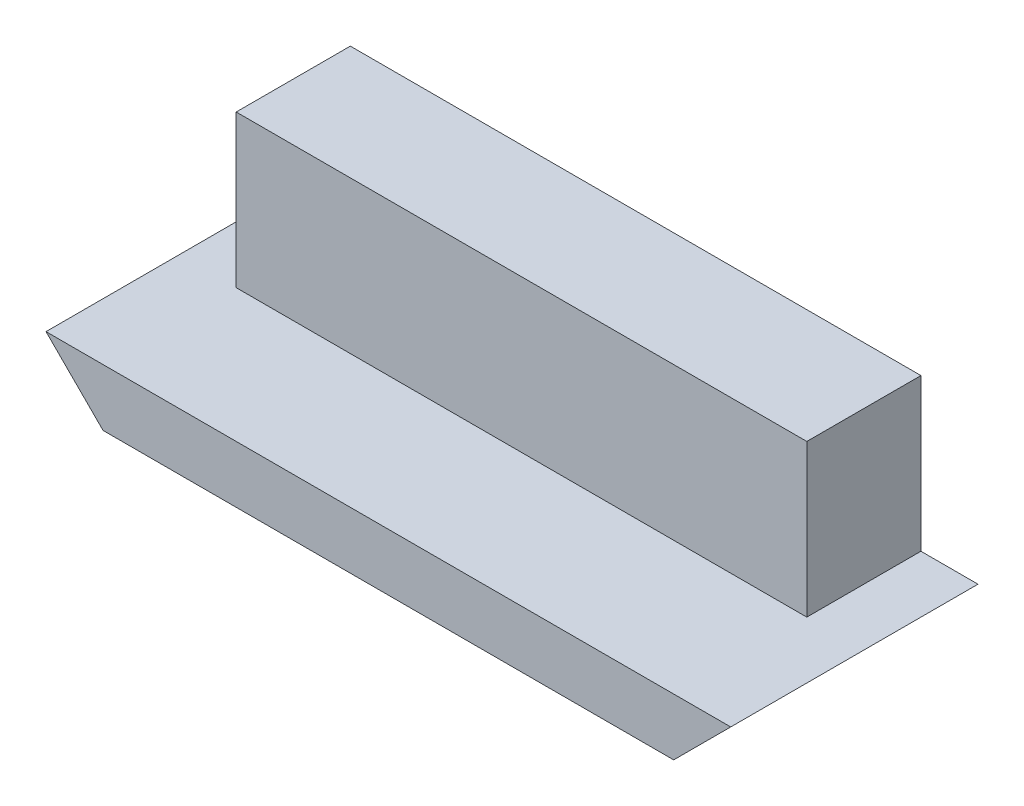
ISO-10303-21;
HEADER;
FILE_DESCRIPTION(('STEP AP214'),'2;1');
FILE_NAME('part.step','',(''),(''),'','','');
FILE_SCHEMA(('AUTOMOTIVE_DESIGN { 1 0 10303 214 1 1 1 1 }'));
ENDSEC;
DATA;
#1=APPLICATION_CONTEXT('core data for automotive mechanical design processes');
#2=APPLICATION_PROTOCOL_DEFINITION('international standard','automotive_design',2000,#1);
#3=PRODUCT_CONTEXT('',#1,'mechanical');
#4=PRODUCT('Part','Part','',(#3));
#5=PRODUCT_RELATED_PRODUCT_CATEGORY('part','',(#4));
#6=PRODUCT_DEFINITION_FORMATION('','',#4);
#7=PRODUCT_DEFINITION_CONTEXT('part definition',#1,'design');
#8=PRODUCT_DEFINITION('design','',#6,#7);
#9=PRODUCT_DEFINITION_SHAPE('','',#8);
#10=(LENGTH_UNIT() NAMED_UNIT(*) SI_UNIT(.MILLI.,.METRE.));
#11=(NAMED_UNIT(*) PLANE_ANGLE_UNIT() SI_UNIT($,.RADIAN.));
#12=(NAMED_UNIT(*) SI_UNIT($,.STERADIAN.) SOLID_ANGLE_UNIT());
#13=UNCERTAINTY_MEASURE_WITH_UNIT(LENGTH_MEASURE(1.E-05),#10,'distance_accuracy_value','');
#14=(GEOMETRIC_REPRESENTATION_CONTEXT(3) GLOBAL_UNCERTAINTY_ASSIGNED_CONTEXT((#13)) GLOBAL_UNIT_ASSIGNED_CONTEXT((#10,
#11,#12)) REPRESENTATION_CONTEXT('',''));
#15=CARTESIAN_POINT('',(0.,0.,0.));
#16=DIRECTION('',(0.,0.,1.));
#17=DIRECTION('',(1.,0.,0.));
#18=AXIS2_PLACEMENT_3D('',#15,#16,#17);
#19=CARTESIAN_POINT('',(15.,1.5,6.5));
#20=DIRECTION('',(-1.,0.,0.));
#21=DIRECTION('',(0.,0.,1.));
#22=AXIS2_PLACEMENT_3D('',#19,#20,#21);
#23=PLANE('',#22);
#24=DIRECTION('',(0.,-1.,0.));
#25=VECTOR('',#24,1.);
#26=CARTESIAN_POINT('',(15.,1.5,3.));
#27=LINE('',#26,#25);
#28=CARTESIAN_POINT('',(15.,5.5,3.));
#29=VERTEX_POINT('',#28);
#30=CARTESIAN_POINT('',(15.,1.5,3.));
#31=VERTEX_POINT('',#30);
#32=EDGE_CURVE('E118',#29,#31,#27,.T.);
#33=ORIENTED_EDGE('',*,*,#32,.T.);
#34=DIRECTION('',(0.,0.,-1.));
#35=VECTOR('',#34,1.);
#36=CARTESIAN_POINT('',(15.,1.5,6.5));
#37=LINE('',#36,#35);
#38=CARTESIAN_POINT('',(15.,1.5,0.));
#39=VERTEX_POINT('',#38);
#40=EDGE_CURVE('E130',#31,#39,#37,.T.);
#41=ORIENTED_EDGE('',*,*,#40,.T.);
#42=DIRECTION('',(0.,1.,0.));
#43=VECTOR('',#42,1.);
#44=CARTESIAN_POINT('',(15.,1.5,0.));
#45=LINE('',#44,#43);
#46=CARTESIAN_POINT('',(15.,5.5,0.));
#47=VERTEX_POINT('',#46);
#48=EDGE_CURVE('E172',#39,#47,#45,.T.);
#49=ORIENTED_EDGE('',*,*,#48,.T.);
#50=DIRECTION('',(0.,0.,-1.));
#51=VECTOR('',#50,1.);
#52=CARTESIAN_POINT('',(15.,5.5,6.5));
#53=LINE('',#52,#51);
#54=EDGE_CURVE('E132',#29,#47,#53,.T.);
#55=ORIENTED_EDGE('',*,*,#54,.F.);
#56=EDGE_LOOP('',(#33,#41,#49,#55));
#57=FACE_BOUND('',#56,.T.);
#58=ADVANCED_FACE('F41',(#57),#23,.F.);
#59=CARTESIAN_POINT('',(0.,5.5,6.5));
#60=DIRECTION('',(0.,-1.,0.));
#61=DIRECTION('',(0.,0.,-1.));
#62=AXIS2_PLACEMENT_3D('',#59,#60,#61);
#63=PLANE('',#62);
#64=DIRECTION('',(1.,0.,0.));
#65=VECTOR('',#64,1.);
#66=CARTESIAN_POINT('',(0.,5.5,3.));
#67=LINE('',#66,#65);
#68=CARTESIAN_POINT('',(0.,5.5,3.));
#69=VERTEX_POINT('',#68);
#70=EDGE_CURVE('E134',#69,#29,#67,.T.);
#71=ORIENTED_EDGE('',*,*,#70,.T.);
#72=ORIENTED_EDGE('',*,*,#54,.T.);
#73=DIRECTION('',(-1.,0.,0.));
#74=VECTOR('',#73,1.);
#75=CARTESIAN_POINT('',(0.,5.5,0.));
#76=LINE('',#75,#74);
#77=CARTESIAN_POINT('',(0.,5.5,0.));
#78=VERTEX_POINT('',#77);
#79=EDGE_CURVE('E168',#47,#78,#76,.T.);
#80=ORIENTED_EDGE('',*,*,#79,.T.);
#81=DIRECTION('',(0.,0.,-1.));
#82=VECTOR('',#81,1.);
#83=CARTESIAN_POINT('',(0.,5.5,6.5));
#84=LINE('',#83,#82);
#85=EDGE_CURVE('E145',#69,#78,#84,.T.);
#86=ORIENTED_EDGE('',*,*,#85,.F.);
#87=EDGE_LOOP('',(#71,#72,#80,#86));
#88=FACE_BOUND('',#87,.T.);
#89=ADVANCED_FACE('F197',(#88),#63,.F.);
#90=CARTESIAN_POINT('',(0.,1.5,6.5));
#91=DIRECTION('',(1.,0.,0.));
#92=DIRECTION('',(0.,0.,-1.));
#93=AXIS2_PLACEMENT_3D('',#90,#91,#92);
#94=PLANE('',#93);
#95=DIRECTION('',(0.,1.,0.));
#96=VECTOR('',#95,1.);
#97=CARTESIAN_POINT('',(0.,1.5,3.));
#98=LINE('',#97,#96);
#99=CARTESIAN_POINT('',(0.,1.5,3.));
#100=VERTEX_POINT('',#99);
#101=EDGE_CURVE('E121',#100,#69,#98,.T.);
#102=ORIENTED_EDGE('',*,*,#101,.T.);
#103=ORIENTED_EDGE('',*,*,#85,.T.);
#104=DIRECTION('',(0.,-1.,0.));
#105=VECTOR('',#104,1.);
#106=CARTESIAN_POINT('',(0.,1.5,0.));
#107=LINE('',#106,#105);
#108=CARTESIAN_POINT('',(0.,1.5,0.));
#109=VERTEX_POINT('',#108);
#110=EDGE_CURVE('E164',#78,#109,#107,.T.);
#111=ORIENTED_EDGE('',*,*,#110,.T.);
#112=DIRECTION('',(0.,0.,-1.));
#113=VECTOR('',#112,1.);
#114=CARTESIAN_POINT('',(0.,1.5,6.5));
#115=LINE('',#114,#113);
#116=EDGE_CURVE('E150',#100,#109,#115,.T.);
#117=ORIENTED_EDGE('',*,*,#116,.F.);
#118=EDGE_LOOP('',(#102,#103,#111,#117));
#119=FACE_BOUND('',#118,.T.);
#120=ADVANCED_FACE('F199',(#119),#94,.F.);
#121=CARTESIAN_POINT('',(0.,0.,6.5));
#122=DIRECTION('',(0.,1.,0.));
#123=DIRECTION('',(0.,0.,1.));
#124=AXIS2_PLACEMENT_3D('',#121,#122,#123);
#125=PLANE('',#124);
#126=DIRECTION('',(1.,0.,0.));
#127=VECTOR('',#126,1.);
#128=CARTESIAN_POINT('',(0.,0.,0.));
#129=LINE('',#128,#127);
#130=CARTESIAN_POINT('',(0.,0.,0.));
#131=VERTEX_POINT('',#130);
#132=CARTESIAN_POINT('',(15.,0.,0.));
#133=VERTEX_POINT('',#132);
#134=EDGE_CURVE('E125',#131,#133,#129,.T.);
#135=ORIENTED_EDGE('',*,*,#134,.T.);
#136=DIRECTION('',(0.,0.,-1.));
#137=VECTOR('',#136,1.);
#138=CARTESIAN_POINT('',(15.,0.,6.5));
#139=LINE('',#138,#137);
#140=CARTESIAN_POINT('',(15.,0.,6.5));
#141=VERTEX_POINT('',#140);
#142=EDGE_CURVE('E12',#141,#133,#139,.T.);
#143=ORIENTED_EDGE('',*,*,#142,.F.);
#144=DIRECTION('',(1.,0.,0.));
#145=VECTOR('',#144,1.);
#146=CARTESIAN_POINT('',(0.,0.,6.5));
#147=LINE('',#146,#145);
#148=CARTESIAN_POINT('',(0.,0.,6.5));
#149=VERTEX_POINT('',#148);
#150=EDGE_CURVE('E161',#149,#141,#147,.T.);
#151=ORIENTED_EDGE('',*,*,#150,.F.);
#152=DIRECTION('',(0.,0.,-1.));
#153=VECTOR('',#152,1.);
#154=CARTESIAN_POINT('',(0.,0.,6.5));
#155=LINE('',#154,#153);
#156=EDGE_CURVE('E156',#149,#131,#155,.T.);
#157=ORIENTED_EDGE('',*,*,#156,.T.);
#158=EDGE_LOOP('',(#135,#143,#151,#157));
#159=FACE_BOUND('',#158,.T.);
#160=ADVANCED_FACE('F43',(#159),#125,.F.);
#161=CARTESIAN_POINT('',(15.,0.,6.5));
#162=DIRECTION('',(-0.707106781186548,0.707106781186546,0.));
#163=DIRECTION('',(-0.707106781186547,-0.707106781186549,0.));
#164=AXIS2_PLACEMENT_3D('',#161,#162,#163);
#165=PLANE('',#164);
#166=DIRECTION('',(0.707106781186547,0.707106781186549,0.));
#167=VECTOR('',#166,1.);
#168=CARTESIAN_POINT('',(15.,0.,0.));
#169=LINE('',#168,#167);
#170=CARTESIAN_POINT('',(16.5,1.5,0.));
#171=VERTEX_POINT('',#170);
#172=EDGE_CURVE('E177',#133,#171,#169,.T.);
#173=ORIENTED_EDGE('',*,*,#172,.T.);
#174=DIRECTION('',(0.,0.,-1.));
#175=VECTOR('',#174,1.);
#176=CARTESIAN_POINT('',(16.5,1.5,6.5));
#177=LINE('',#176,#175);
#178=CARTESIAN_POINT('',(16.5,1.5,6.5));
#179=VERTEX_POINT('',#178);
#180=EDGE_CURVE('E51',#179,#171,#177,.T.);
#181=ORIENTED_EDGE('',*,*,#180,.F.);
#182=DIRECTION('',(0.707106781186547,0.707106781186549,0.));
#183=VECTOR('',#182,1.);
#184=CARTESIAN_POINT('',(15.,0.,6.5));
#185=LINE('',#184,#183);
#186=EDGE_CURVE('E101',#141,#179,#185,.T.);
#187=ORIENTED_EDGE('',*,*,#186,.F.);
#188=ORIENTED_EDGE('',*,*,#142,.T.);
#189=EDGE_LOOP('',(#173,#181,#187,#188));
#190=FACE_BOUND('',#189,.T.);
#191=ADVANCED_FACE('F211',(#190),#165,.F.);
#192=CARTESIAN_POINT('',(-1.5,1.5,6.5));
#193=DIRECTION('',(0.,-1.,0.));
#194=DIRECTION('',(0.,0.,-1.));
#195=AXIS2_PLACEMENT_3D('',#192,#193,#194);
#196=PLANE('',#195);
#197=DIRECTION('',(-1.,0.,0.));
#198=VECTOR('',#197,1.);
#199=CARTESIAN_POINT('',(-1.5,1.5,0.));
#200=LINE('',#199,#198);
#201=CARTESIAN_POINT('',(-1.5,1.5,0.));
#202=VERTEX_POINT('',#201);
#203=EDGE_CURVE('E88',#109,#202,#200,.T.);
#204=ORIENTED_EDGE('',*,*,#203,.T.);
#205=DIRECTION('',(0.,0.,-1.));
#206=VECTOR('',#205,1.);
#207=CARTESIAN_POINT('',(-1.5,1.5,6.5));
#208=LINE('',#207,#206);
#209=CARTESIAN_POINT('',(-1.5,1.5,6.5));
#210=VERTEX_POINT('',#209);
#211=EDGE_CURVE('E153',#210,#202,#208,.T.);
#212=ORIENTED_EDGE('',*,*,#211,.F.);
#213=DIRECTION('',(-1.,0.,0.));
#214=VECTOR('',#213,1.);
#215=CARTESIAN_POINT('',(16.5,1.5,6.5));
#216=LINE('',#215,#214);
#217=EDGE_CURVE('E185',#179,#210,#216,.T.);
#218=ORIENTED_EDGE('',*,*,#217,.F.);
#219=ORIENTED_EDGE('',*,*,#180,.T.);
#220=DIRECTION('',(-1.,0.,0.));
#221=VECTOR('',#220,1.);
#222=CARTESIAN_POINT('',(16.5,1.5,0.));
#223=LINE('',#222,#221);
#224=EDGE_CURVE('E139',#171,#39,#223,.T.);
#225=ORIENTED_EDGE('',*,*,#224,.T.);
#226=ORIENTED_EDGE('',*,*,#40,.F.);
#227=DIRECTION('',(-1.,0.,0.));
#228=VECTOR('',#227,1.);
#229=CARTESIAN_POINT('',(0.,1.5,3.));
#230=LINE('',#229,#228);
#231=EDGE_CURVE('E115',#31,#100,#230,.T.);
#232=ORIENTED_EDGE('',*,*,#231,.T.);
#233=ORIENTED_EDGE('',*,*,#116,.T.);
#234=EDGE_LOOP('',(#204,#212,#218,#219,#225,#226,#232,#233));
#235=FACE_BOUND('',#234,.T.);
#236=ADVANCED_FACE('F136',(#235),#196,.F.);
#237=CARTESIAN_POINT('',(0.,0.,6.5));
#238=DIRECTION('',(0.707106781186548,0.707106781186548,0.));
#239=DIRECTION('',(-0.707106781186548,0.707106781186548,0.));
#240=AXIS2_PLACEMENT_3D('',#237,#238,#239);
#241=PLANE('',#240);
#242=DIRECTION('',(0.707106781186548,-0.707106781186548,0.));
#243=VECTOR('',#242,1.);
#244=CARTESIAN_POINT('',(0.,0.,0.));
#245=LINE('',#244,#243);
#246=EDGE_CURVE('E94',#202,#131,#245,.T.);
#247=ORIENTED_EDGE('',*,*,#246,.T.);
#248=ORIENTED_EDGE('',*,*,#156,.F.);
#249=DIRECTION('',(0.707106781186548,-0.707106781186548,0.));
#250=VECTOR('',#249,1.);
#251=CARTESIAN_POINT('',(0.,0.,6.5));
#252=LINE('',#251,#250);
#253=EDGE_CURVE('E59',#210,#149,#252,.T.);
#254=ORIENTED_EDGE('',*,*,#253,.F.);
#255=ORIENTED_EDGE('',*,*,#211,.T.);
#256=EDGE_LOOP('',(#247,#248,#254,#255));
#257=FACE_BOUND('',#256,.T.);
#258=ADVANCED_FACE('F208',(#257),#241,.F.);
#259=CARTESIAN_POINT('',(0.,0.,6.5));
#260=DIRECTION('',(0.,0.,1.));
#261=DIRECTION('',(1.,0.,0.));
#262=AXIS2_PLACEMENT_3D('',#259,#260,#261);
#263=PLANE('',#262);
#264=ORIENTED_EDGE('',*,*,#217,.T.);
#265=ORIENTED_EDGE('',*,*,#253,.T.);
#266=ORIENTED_EDGE('',*,*,#150,.T.);
#267=ORIENTED_EDGE('',*,*,#186,.T.);
#268=EDGE_LOOP('',(#264,#265,#266,#267));
#269=FACE_BOUND('',#268,.T.);
#270=ADVANCED_FACE('F210',(#269),#263,.T.);
#271=CARTESIAN_POINT('',(0.,0.,0.));
#272=DIRECTION('',(0.,0.,1.));
#273=DIRECTION('',(1.,0.,0.));
#274=AXIS2_PLACEMENT_3D('',#271,#272,#273);
#275=PLANE('',#274);
#276=ORIENTED_EDGE('',*,*,#134,.F.);
#277=ORIENTED_EDGE('',*,*,#246,.F.);
#278=ORIENTED_EDGE('',*,*,#203,.F.);
#279=ORIENTED_EDGE('',*,*,#110,.F.);
#280=ORIENTED_EDGE('',*,*,#79,.F.);
#281=ORIENTED_EDGE('',*,*,#48,.F.);
#282=ORIENTED_EDGE('',*,*,#224,.F.);
#283=ORIENTED_EDGE('',*,*,#172,.F.);
#284=EDGE_LOOP('',(#276,#277,#278,#279,#280,#281,#282,#283));
#285=FACE_BOUND('',#284,.T.);
#286=ADVANCED_FACE('F204',(#285),#275,.F.);
#287=CARTESIAN_POINT('',(0.,0.,3.));
#288=DIRECTION('',(0.,0.,1.));
#289=DIRECTION('',(1.,0.,0.));
#290=AXIS2_PLACEMENT_3D('',#287,#288,#289);
#291=PLANE('',#290);
#292=ORIENTED_EDGE('',*,*,#101,.F.);
#293=ORIENTED_EDGE('',*,*,#231,.F.);
#294=ORIENTED_EDGE('',*,*,#32,.F.);
#295=ORIENTED_EDGE('',*,*,#70,.F.);
#296=EDGE_LOOP('',(#292,#293,#294,#295));
#297=FACE_BOUND('',#296,.T.);
#298=ADVANCED_FACE('F117',(#297),#291,.T.);
#299=CLOSED_SHELL('',(#58,#89,#120,#160,#191,#236,#258,#270,#286,#298));
#300=MANIFOLD_SOLID_BREP('B2',#299);
#301=ADVANCED_BREP_SHAPE_REPRESENTATION('',(#18,#300),#14);
#302=SHAPE_DEFINITION_REPRESENTATION(#9,#301);
ENDSEC;
END-ISO-10303-21;
